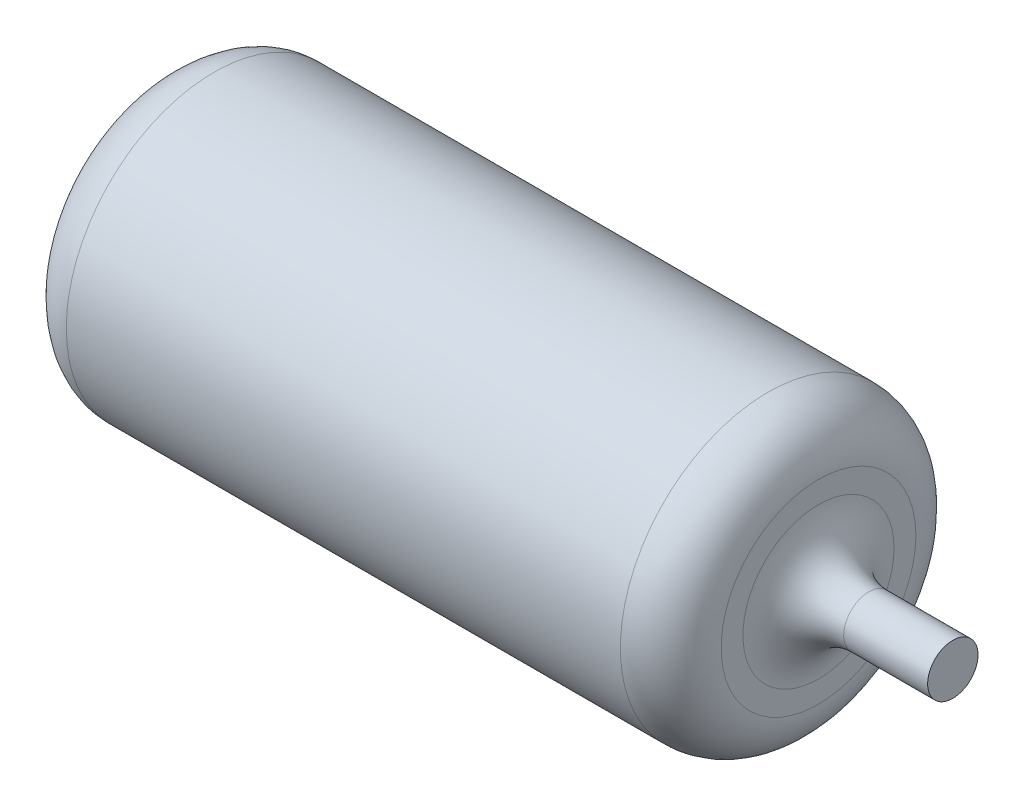
ISO-10303-21;
HEADER;
FILE_DESCRIPTION(('STEP AP214'),'2;1');
FILE_NAME('part.step','',(''),(''),'','','');
FILE_SCHEMA(('AUTOMOTIVE_DESIGN { 1 0 10303 214 1 1 1 1 }'));
ENDSEC;
DATA;
#1=APPLICATION_CONTEXT('core data for automotive mechanical design processes');
#2=APPLICATION_PROTOCOL_DEFINITION('international standard','automotive_design',2000,#1);
#3=PRODUCT_CONTEXT('',#1,'mechanical');
#4=PRODUCT('Part','Part','',(#3));
#5=PRODUCT_RELATED_PRODUCT_CATEGORY('part','',(#4));
#6=PRODUCT_DEFINITION_FORMATION('','',#4);
#7=PRODUCT_DEFINITION_CONTEXT('part definition',#1,'design');
#8=PRODUCT_DEFINITION('design','',#6,#7);
#9=PRODUCT_DEFINITION_SHAPE('','',#8);
#10=(LENGTH_UNIT() NAMED_UNIT(*) SI_UNIT(.MILLI.,.METRE.));
#11=(NAMED_UNIT(*) PLANE_ANGLE_UNIT() SI_UNIT($,.RADIAN.));
#12=(NAMED_UNIT(*) SI_UNIT($,.STERADIAN.) SOLID_ANGLE_UNIT());
#13=UNCERTAINTY_MEASURE_WITH_UNIT(LENGTH_MEASURE(1.E-05),#10,'distance_accuracy_value','');
#14=(GEOMETRIC_REPRESENTATION_CONTEXT(3) GLOBAL_UNCERTAINTY_ASSIGNED_CONTEXT((#13)) GLOBAL_UNIT_ASSIGNED_CONTEXT((#10,
#11,#12)) REPRESENTATION_CONTEXT('',''));
#15=CARTESIAN_POINT('',(0.,0.,0.));
#16=DIRECTION('',(0.,0.,1.));
#17=DIRECTION('',(1.,0.,0.));
#18=AXIS2_PLACEMENT_3D('',#15,#16,#17);
#19=CARTESIAN_POINT('',(0.,0.,0.));
#20=DIRECTION('',(-1.,0.,0.));
#21=DIRECTION('',(0.,0.,1.));
#22=AXIS2_PLACEMENT_3D('',#19,#20,#21);
#23=PLANE('',#22);
#24=CARTESIAN_POINT('',(0.,0.,-17.78));
#25=CARTESIAN_POINT('',(0.,2.32739655630741,-17.78));
#26=CARTESIAN_POINT('',(0.,4.65387738504043,-17.317234190695));
#27=CARTESIAN_POINT('',(0.,8.95434546986221,-15.5359219854064));
#28=CARTESIAN_POINT('',(0.,10.9266406820217,-14.21807645697));
#29=CARTESIAN_POINT('',(0.,14.2180764569719,-10.9266406820237));
#30=CARTESIAN_POINT('',(0.,15.5359219854104,-8.95434546986018));
#31=CARTESIAN_POINT('',(0.,17.3172341906909,-4.65387738504243));
#32=CARTESIAN_POINT('',(0.,17.78,-2.32739655630741));
#33=CARTESIAN_POINT('',(0.,17.78,2.32739655630741));
#34=CARTESIAN_POINT('',(0.,17.317234190695,4.65387738504242));
#35=CARTESIAN_POINT('',(0.,15.5359219854064,8.95434546986016));
#36=CARTESIAN_POINT('',(0.,14.2180764569707,10.9266406820209));
#37=CARTESIAN_POINT('',(0.,10.9266406820229,14.2180764569727));
#38=CARTESIAN_POINT('',(0.,8.95434546986097,15.5359219854081));
#39=CARTESIAN_POINT('',(0.,4.65387738504162,17.3172341906932));
#40=CARTESIAN_POINT('',(0.,2.32739655631956,17.78));
#41=CARTESIAN_POINT('',(0.,-2.32739655631956,17.78));
#42=CARTESIAN_POINT('',(0.,-4.65387738504465,17.3172341906932));
#43=CARTESIAN_POINT('',(0.,-8.95434546985794,15.5359219854082));
#44=CARTESIAN_POINT('',(0.,-10.9266406820269,14.2180764569687));
#45=CARTESIAN_POINT('',(0.,-14.2180764569667,10.9266406820249));
#46=CARTESIAN_POINT('',(0.,-15.5359219854024,8.95434546987834));
#47=CARTESIAN_POINT('',(0.,-17.317234190699,4.65387738502426));
#48=CARTESIAN_POINT('',(0.,-17.78,2.32739655630742));
#49=CARTESIAN_POINT('',(0.,-17.78,-2.3273965563074));
#50=CARTESIAN_POINT('',(0.,-17.317234190695,-4.65387738504144));
#51=CARTESIAN_POINT('',(0.,-15.5359219854064,-8.9543454698612));
#52=CARTESIAN_POINT('',(0.,-14.218076456972,-10.9266406820217));
#53=CARTESIAN_POINT('',(0.,-10.9266406820217,-14.2180764569719));
#54=CARTESIAN_POINT('',(0.,-8.95434546986115,-15.5359219854064));
#55=CARTESIAN_POINT('',(0.,-4.65387738504139,-17.317234190695));
#56=CARTESIAN_POINT('',(0.,-2.32739655630741,-17.78));
#57=CARTESIAN_POINT('',(0.,0.,-17.78));
#58=(BOUNDED_CURVE() B_SPLINE_CURVE(3,(#24,#25,#26,#27,#28,#29,#30,#31,#32,#33,#34,#35,#36,#37,
#38,#39,#40,#41,#42,#43,#44,#45,#46,#47,#48,#49,#50,#51,#52,#53,#54,#55,#56,#57),.UNSPECIFIED.,
.T.,.F.) B_SPLINE_CURVE_WITH_KNOTS((4,2,2,2,2,2,2,2,2,2,2,2,2,2,2,2,4),(-3.14159265358979,
-2.74889357189107,-2.35619449019234,-1.96349540849362,-1.5707963267949,-1.17809724509617,
-0.785398163397448,-0.392699081698724,0.,0.392699081698724,0.785398163397448,1.17809724509617,
1.5707963267949,1.96349540849362,2.35619449019234,2.74889357189107,3.14159265358979),
.UNSPECIFIED.) CURVE() GEOMETRIC_REPRESENTATION_ITEM() RATIONAL_B_SPLINE_CURVE((1.,1.,1.,1.,1.,
1.,1.,1.,1.,1.,1.,1.,1.,1.,1.,1.,1.,1.,1.,1.,1.,1.,1.,1.,1.,1.,1.,1.,1.,1.,1.,1.,1.,1.)) REPRESENTATION_ITEM(''));
#59=CARTESIAN_POINT('',(0.,0.,-17.78));
#60=VERTEX_POINT('',#59);
#61=EDGE_CURVE('E62',#60,#60,#58,.F.);
#62=ORIENTED_EDGE('',*,*,#61,.T.);
#63=EDGE_LOOP('',(#62));
#64=FACE_BOUND('',#63,.T.);
#65=ADVANCED_FACE('F42',(#64),#23,.T.);
#66=CARTESIAN_POINT('',(0.,0.,0.));
#67=DIRECTION('',(1.,0.,0.));
#68=DIRECTION('',(0.,0.,-1.));
#69=AXIS2_PLACEMENT_3D('',#66,#67,#68);
#70=CYLINDRICAL_SURFACE('',#69,55.88);
#71=CARTESIAN_POINT('',(234.95,0.,0.));
#72=DIRECTION('',(1.,0.,0.));
#73=DIRECTION('',(0.,0.,-1.));
#74=AXIS2_PLACEMENT_3D('',#71,#72,#73);
#75=CIRCLE('',#74,55.88);
#76=CARTESIAN_POINT('',(234.95,0.,-55.88));
#77=VERTEX_POINT('',#76);
#78=EDGE_CURVE('E49',#77,#77,#75,.F.);
#79=ORIENTED_EDGE('',*,*,#78,.T.);
#80=EDGE_LOOP('',(#79));
#81=FACE_BOUND('',#80,.T.);
#82=CARTESIAN_POINT('',(25.4,0.,-55.88));
#83=CARTESIAN_POINT('',(25.4,-7.31467489125185,-55.88));
#84=CARTESIAN_POINT('',(25.4,-14.6264717815592,-54.4255931707498));
#85=CARTESIAN_POINT('',(25.4,-28.1422286195631,-48.8271833827117));
#86=CARTESIAN_POINT('',(25.4,-34.3408707149236,-44.685383150485));
#87=CARTESIAN_POINT('',(25.4,-44.6853831504851,-34.3408707149235));
#88=CARTESIAN_POINT('',(25.4,-48.8271833827111,-28.1422286195644));
#89=CARTESIAN_POINT('',(25.4,-54.4255931707502,-14.6264717815582));
#90=CARTESIAN_POINT('',(25.4,-55.88,-7.31467489125181));
#91=CARTESIAN_POINT('',(25.4,-55.88,7.31467489125189));
#92=CARTESIAN_POINT('',(25.4,-54.4255931707735,14.6264717815019));
#93=CARTESIAN_POINT('',(25.4,-48.8271833826879,28.1422286196206));
#94=CARTESIAN_POINT('',(25.4,-44.6853831504667,34.3408707149419));
#95=CARTESIAN_POINT('',(25.4,-34.3408707149418,44.6853831504668));
#96=CARTESIAN_POINT('',(25.4,-28.1422286195538,48.8271833827155));
#97=CARTESIAN_POINT('',(25.4,-14.6264717815686,54.4255931707459));
#98=CARTESIAN_POINT('',(25.4,-7.31467489129005,55.88));
#99=CARTESIAN_POINT('',(25.4,7.31467489129005,55.88));
#100=CARTESIAN_POINT('',(25.4,14.6264717815583,54.4255931707502));
#101=CARTESIAN_POINT('',(25.4,28.1422286195642,48.8271833827112));
#102=CARTESIAN_POINT('',(25.4,34.3408707149257,44.6853831504829));
#103=CARTESIAN_POINT('',(25.4,44.6853831504829,34.3408707149257));
#104=CARTESIAN_POINT('',(25.4,48.8271833827129,28.1422286195603));
#105=CARTESIAN_POINT('',(25.4,54.4255931707486,14.6264717815621));
#106=CARTESIAN_POINT('',(25.4,55.88,7.31467489125186));
#107=CARTESIAN_POINT('',(25.4,55.88,-7.31467489125185));
#108=CARTESIAN_POINT('',(25.4,54.4255931707488,-14.6264717815616));
#109=CARTESIAN_POINT('',(25.4,48.8271833827126,-28.1422286195609));
#110=CARTESIAN_POINT('',(25.4,44.685383150481,-34.3408707149276));
#111=CARTESIAN_POINT('',(25.4,34.3408707149275,-44.685383150481));
#112=CARTESIAN_POINT('',(25.4,28.1422286195672,-48.8271833827099));
#113=CARTESIAN_POINT('',(25.4,14.6264717815553,-54.4255931707514));
#114=CARTESIAN_POINT('',(25.4,7.31467489125186,-55.88));
#115=CARTESIAN_POINT('',(25.4,0.,-55.88));
#116=(BOUNDED_CURVE() B_SPLINE_CURVE(3,(#82,#83,#84,#85,#86,#87,#88,#89,#90,#91,#92,#93,#94,#95,
#96,#97,#98,#99,#100,#101,#102,#103,#104,#105,#106,#107,#108,#109,#110,#111,#112,#113,#114,
#115),.UNSPECIFIED.,.T.,.F.) B_SPLINE_CURVE_WITH_KNOTS((4,2,2,2,2,2,2,2,2,2,2,2,2,2,2,2,4),
(-3.14159265358979,-2.74889357189107,-2.35619449019234,-1.96349540849362,-1.5707963267949,
-1.17809724509617,-0.785398163397448,-0.392699081698724,0.,0.392699081698724,0.785398163397448,
1.17809724509617,1.5707963267949,1.96349540849362,2.35619449019234,2.74889357189107,
3.14159265358979),
.UNSPECIFIED.) CURVE() GEOMETRIC_REPRESENTATION_ITEM() RATIONAL_B_SPLINE_CURVE((1.,1.,1.,1.,1.,
1.,1.,1.,1.,1.,1.,1.,1.,1.,1.,1.,1.,1.,1.,1.,1.,1.,1.,1.,1.,1.,1.,1.,1.,1.,1.,1.,1.,1.)) REPRESENTATION_ITEM(''));
#117=CARTESIAN_POINT('',(25.4,0.,-55.88));
#118=VERTEX_POINT('',#117);
#119=EDGE_CURVE('E121',#118,#118,#116,.F.);
#120=ORIENTED_EDGE('',*,*,#119,.T.);
#121=EDGE_LOOP('',(#120));
#122=FACE_BOUND('',#121,.T.);
#123=ADVANCED_FACE('F137',(#81,#122),#70,.T.);
#124=CARTESIAN_POINT('',(254.,55.88,0.));
#125=DIRECTION('',(1.,0.,0.));
#126=DIRECTION('',(0.,0.,-1.));
#127=AXIS2_PLACEMENT_3D('',#124,#125,#126);
#128=PLANE('',#127);
#129=CARTESIAN_POINT('',(254.,0.,0.));
#130=DIRECTION('',(1.,0.,0.));
#131=DIRECTION('',(0.,0.,-1.));
#132=AXIS2_PLACEMENT_3D('',#129,#130,#131);
#133=CIRCLE('',#132,36.83);
#134=CARTESIAN_POINT('',(254.,0.,-36.83));
#135=VERTEX_POINT('',#134);
#136=EDGE_CURVE('E53',#135,#135,#133,.T.);
#137=ORIENTED_EDGE('',*,*,#136,.T.);
#138=EDGE_LOOP('',(#137));
#139=FACE_BOUND('',#138,.T.);
#140=CARTESIAN_POINT('',(254.,0.,0.));
#141=DIRECTION('',(1.,0.,0.));
#142=DIRECTION('',(0.,0.,-1.));
#143=AXIS2_PLACEMENT_3D('',#140,#141,#142);
#144=CIRCLE('',#143,28.575);
#145=CARTESIAN_POINT('',(254.,0.,-28.575));
#146=VERTEX_POINT('',#145);
#147=EDGE_CURVE('E57',#146,#146,#144,.F.);
#148=ORIENTED_EDGE('',*,*,#147,.T.);
#149=EDGE_LOOP('',(#148));
#150=FACE_BOUND('',#149,.T.);
#151=ADVANCED_FACE('F146',(#139,#150),#128,.T.);
#152=CARTESIAN_POINT('',(0.,0.,0.));
#153=DIRECTION('',(1.,0.,0.));
#154=DIRECTION('',(0.,0.,-1.));
#155=AXIS2_PLACEMENT_3D('',#152,#153,#154);
#156=CYLINDRICAL_SURFACE('',#155,9.52500000000003);
#157=CARTESIAN_POINT('',(273.05,0.,0.));
#158=DIRECTION('',(1.,0.,0.));
#159=DIRECTION('',(0.,0.,-1.));
#160=AXIS2_PLACEMENT_3D('',#157,#158,#159);
#161=CIRCLE('',#160,9.52500000000003);
#162=CARTESIAN_POINT('',(273.05,0.,-9.52500000000003));
#163=VERTEX_POINT('',#162);
#164=EDGE_CURVE('E11',#163,#163,#161,.T.);
#165=ORIENTED_EDGE('',*,*,#164,.T.);
#166=EDGE_LOOP('',(#165));
#167=FACE_BOUND('',#166,.T.);
#168=CARTESIAN_POINT('',(304.8,0.,0.));
#169=DIRECTION('',(1.,0.,0.));
#170=DIRECTION('',(0.,0.,-1.));
#171=AXIS2_PLACEMENT_3D('',#168,#169,#170);
#172=CIRCLE('',#171,9.52500000000003);
#173=CARTESIAN_POINT('',(304.8,0.,-9.52500000000003));
#174=VERTEX_POINT('',#173);
#175=EDGE_CURVE('E215',#174,#174,#172,.T.);
#176=ORIENTED_EDGE('',*,*,#175,.F.);
#177=EDGE_LOOP('',(#176));
#178=FACE_BOUND('',#177,.T.);
#179=ADVANCED_FACE('F149',(#167,#178),#156,.T.);
#180=CARTESIAN_POINT('',(304.8,9.52500000000003,0.));
#181=DIRECTION('',(1.,0.,0.));
#182=DIRECTION('',(0.,0.,-1.));
#183=AXIS2_PLACEMENT_3D('',#180,#181,#182);
#184=PLANE('',#183);
#185=ORIENTED_EDGE('',*,*,#175,.T.);
#186=EDGE_LOOP('',(#185));
#187=FACE_BOUND('',#186,.T.);
#188=ADVANCED_FACE('F83',(#187),#184,.T.);
#189=CARTESIAN_POINT('',(0.,0.,-17.78));
#190=CARTESIAN_POINT('',(0.,-2.32739655630741,-17.78));
#191=CARTESIAN_POINT('',(0.,-4.65387738504139,-17.317234190695));
#192=CARTESIAN_POINT('',(0.,-8.95434546986115,-15.5359219854064));
#193=CARTESIAN_POINT('',(0.,-10.9266406820217,-14.2180764569719));
#194=CARTESIAN_POINT('',(0.,-14.218076456972,-10.9266406820217));
#195=CARTESIAN_POINT('',(0.,-15.5359219854064,-8.9543454698612));
#196=CARTESIAN_POINT('',(0.,-17.317234190695,-4.65387738504144));
#197=CARTESIAN_POINT('',(0.,-17.78,-2.3273965563074));
#198=CARTESIAN_POINT('',(0.,-17.78,2.32739655630742));
#199=CARTESIAN_POINT('',(0.,-17.317234190699,4.65387738502426));
#200=CARTESIAN_POINT('',(0.,-15.5359219854024,8.95434546987834));
#201=CARTESIAN_POINT('',(0.,-14.2180764569667,10.9266406820249));
#202=CARTESIAN_POINT('',(0.,-10.9266406820269,14.2180764569687));
#203=CARTESIAN_POINT('',(0.,-8.95434546985794,15.5359219854082));
#204=CARTESIAN_POINT('',(0.,-4.65387738504465,17.3172341906932));
#205=CARTESIAN_POINT('',(0.,-2.32739655631956,17.78));
#206=CARTESIAN_POINT('',(0.,2.32739655631956,17.78));
#207=CARTESIAN_POINT('',(0.,4.65387738504162,17.3172341906932));
#208=CARTESIAN_POINT('',(0.,8.95434546986097,15.5359219854081));
#209=CARTESIAN_POINT('',(0.,10.9266406820229,14.2180764569727));
#210=CARTESIAN_POINT('',(0.,14.2180764569707,10.9266406820209));
#211=CARTESIAN_POINT('',(0.,15.5359219854064,8.95434546986016));
#212=CARTESIAN_POINT('',(0.,17.317234190695,4.65387738504242));
#213=CARTESIAN_POINT('',(0.,17.78,2.32739655630741));
#214=CARTESIAN_POINT('',(0.,17.78,-2.32739655630741));
#215=CARTESIAN_POINT('',(0.,17.3172341906909,-4.65387738504243));
#216=CARTESIAN_POINT('',(0.,15.5359219854104,-8.95434546986018));
#217=CARTESIAN_POINT('',(0.,14.2180764569719,-10.9266406820237));
#218=CARTESIAN_POINT('',(0.,10.9266406820217,-14.21807645697));
#219=CARTESIAN_POINT('',(0.,8.95434546986221,-15.5359219854064));
#220=CARTESIAN_POINT('',(0.,4.65387738504043,-17.317234190695));
#221=CARTESIAN_POINT('',(0.,2.32739655630741,-17.78));
#222=CARTESIAN_POINT('',(0.,0.,-17.78));
#223=CARTESIAN_POINT('',(0.,0.,-55.88));
#224=CARTESIAN_POINT('',(0.,-7.31467489125185,-55.88));
#225=CARTESIAN_POINT('',(-8.07824833949173E-12,-14.626471781565,-54.4255931707637));
#226=CARTESIAN_POINT('',(8.07130944558783E-12,-28.1422286195573,-48.8271833826978));
#227=CARTESIAN_POINT('',(0.,-34.3408707149195,-44.6853831504729));
#228=CARTESIAN_POINT('',(0.,-44.6853831504891,-34.3408707149356));
#229=CARTESIAN_POINT('',(0.,-48.8271833827138,-28.1422286195655));
#230=CARTESIAN_POINT('',(0.,-54.4255931707475,-14.6264717815571));
#231=CARTESIAN_POINT('',(4.03738944626989E-12,-55.88,-7.31467489125181));
#232=CARTESIAN_POINT('',(-4.03738944626989E-12,-55.88,7.31467489125189));
#233=CARTESIAN_POINT('',(0.,-54.4255931707799,14.6264717815045));
#234=CARTESIAN_POINT('',(0.,-48.8271833826816,28.1422286196179));
#235=CARTESIAN_POINT('',(0.,-44.6853831504627,34.3408707149378));
#236=CARTESIAN_POINT('',(0.,-34.3408707149458,44.6853831504708));
#237=CARTESIAN_POINT('',(0.,-28.142228619548,48.8271833827113));
#238=CARTESIAN_POINT('',(0.,-14.6264717815744,54.4255931707501));
#239=CARTESIAN_POINT('',(0.,-7.31467489129005,55.88));
#240=CARTESIAN_POINT('',(0.,7.31467489129005,55.88));
#241=CARTESIAN_POINT('',(0.,14.6264717815542,54.4255931707339));
#242=CARTESIAN_POINT('',(0.,28.1422286195682,48.8271833827275));
#243=CARTESIAN_POINT('',(0.,34.3408707149297,44.6853831504869));
#244=CARTESIAN_POINT('',(0.,44.6853831504789,34.3408707149216));
#245=CARTESIAN_POINT('',(0.,48.8271833827058,28.1422286195573));
#246=CARTESIAN_POINT('',(0.,54.4255931707556,14.6264717815651));
#247=CARTESIAN_POINT('',(0.,55.88,7.31467489125186));
#248=CARTESIAN_POINT('',(0.,55.88,-7.31467489125185));
#249=CARTESIAN_POINT('',(0.,54.4255931707556,-14.6264717815651));
#250=CARTESIAN_POINT('',(0.,48.8271833827058,-28.1422286195574));
#251=CARTESIAN_POINT('',(0.,44.6853831504729,-34.3408707149357));
#252=CARTESIAN_POINT('',(0.,34.3408707149356,-44.6853831504729));
#253=CARTESIAN_POINT('',(0.,28.1422286195655,-48.8271833827138));
#254=CARTESIAN_POINT('',(0.,14.6264717815571,-54.4255931707475));
#255=CARTESIAN_POINT('',(0.,7.31467489125186,-55.88));
#256=CARTESIAN_POINT('',(0.,0.,-55.88));
#257=CARTESIAN_POINT('',(25.4,0.,-55.88));
#258=CARTESIAN_POINT('',(25.4,-7.31467489125185,-55.88));
#259=CARTESIAN_POINT('',(25.4,-14.6264717815592,-54.4255931707498));
#260=CARTESIAN_POINT('',(25.4,-28.1422286195631,-48.8271833827117));
#261=CARTESIAN_POINT('',(25.4,-34.3408707149236,-44.685383150485));
#262=CARTESIAN_POINT('',(25.4,-44.6853831504851,-34.3408707149235));
#263=CARTESIAN_POINT('',(25.4,-48.8271833827111,-28.1422286195644));
#264=CARTESIAN_POINT('',(25.4,-54.4255931707502,-14.6264717815582));
#265=CARTESIAN_POINT('',(25.4,-55.88,-7.31467489125181));
#266=CARTESIAN_POINT('',(25.4,-55.88,7.31467489125189));
#267=CARTESIAN_POINT('',(25.4,-54.4255931707735,14.6264717815019));
#268=CARTESIAN_POINT('',(25.4,-48.8271833826879,28.1422286196206));
#269=CARTESIAN_POINT('',(25.4,-44.6853831504667,34.3408707149419));
#270=CARTESIAN_POINT('',(25.4,-34.3408707149418,44.6853831504668));
#271=CARTESIAN_POINT('',(25.4,-28.1422286195538,48.8271833827155));
#272=CARTESIAN_POINT('',(25.4,-14.6264717815686,54.4255931707459));
#273=CARTESIAN_POINT('',(25.4,-7.31467489129005,55.88));
#274=CARTESIAN_POINT('',(25.4,7.31467489129005,55.88));
#275=CARTESIAN_POINT('',(25.4,14.6264717815583,54.4255931707502));
#276=CARTESIAN_POINT('',(25.4,28.1422286195642,48.8271833827112));
#277=CARTESIAN_POINT('',(25.4,34.3408707149257,44.6853831504829));
#278=CARTESIAN_POINT('',(25.4,44.6853831504829,34.3408707149257));
#279=CARTESIAN_POINT('',(25.4,48.8271833827129,28.1422286195603));
#280=CARTESIAN_POINT('',(25.4,54.4255931707486,14.6264717815621));
#281=CARTESIAN_POINT('',(25.4,55.88,7.31467489125186));
#282=CARTESIAN_POINT('',(25.4,55.88,-7.31467489125185));
#283=CARTESIAN_POINT('',(25.4,54.4255931707488,-14.6264717815616));
#284=CARTESIAN_POINT('',(25.4,48.8271833827126,-28.1422286195609));
#285=CARTESIAN_POINT('',(25.4,44.685383150481,-34.3408707149276));
#286=CARTESIAN_POINT('',(25.4,34.3408707149275,-44.685383150481));
#287=CARTESIAN_POINT('',(25.4,28.1422286195672,-48.8271833827099));
#288=CARTESIAN_POINT('',(25.4,14.6264717815553,-54.4255931707514));
#289=CARTESIAN_POINT('',(25.4,7.31467489125186,-55.88));
#290=CARTESIAN_POINT('',(25.4,0.,-55.88));
#291=(BOUNDED_SURFACE() B_SPLINE_SURFACE(2,3,((#189,#190,#191,#192,#193,#194,#195,#196,#197,
#198,#199,#200,#201,#202,#203,#204,#205,#206,#207,#208,#209,#210,#211,#212,#213,#214,#215,#216,
#217,#218,#219,#220,#221,#222),(#223,#224,#225,#226,#227,#228,#229,#230,#231,#232,#233,#234,
#235,#236,#237,#238,#239,#240,#241,#242,#243,#244,#245,#246,#247,#248,#249,#250,#251,#252,#253,
#254,#255,#256),(#257,#258,#259,#260,#261,#262,#263,#264,#265,#266,#267,#268,#269,#270,#271,
#272,#273,#274,#275,#276,#277,#278,#279,#280,#281,#282,#283,#284,#285,#286,#287,#288,#289,
#290)),.UNSPECIFIED.,.F.,.T.,.F.) B_SPLINE_SURFACE_WITH_KNOTS((3,3),(4,2,2,2,2,2,2,2,2,2,2,2,2,
2,2,2,4),(0.,1.),(-3.14159265358979,-2.74889357189107,-2.35619449019234,-1.96349540849362,
-1.5707963267949,-1.17809724509617,-0.785398163397448,-0.392699081698724,0.,0.392699081698724,
0.785398163397448,1.17809724509617,1.5707963267949,1.96349540849362,2.35619449019234,
2.74889357189107,3.14159265358979),
.UNSPECIFIED.) GEOMETRIC_REPRESENTATION_ITEM() RATIONAL_B_SPLINE_SURFACE(((1.,1.,1.,1.,1.,1.,1.,
1.,1.,1.,1.,1.,1.,1.,1.,1.,1.,1.,1.,1.,1.,1.,1.,1.,1.,1.,1.,1.,1.,1.,1.,1.,1.,1.),
(0.707106781186547,0.707106781186547,0.707106781186547,0.707106781186547,0.707106781186548,
0.707106781186548,0.707106781186547,0.707106781186547,0.707106781186547,0.707106781186547,
0.707106781186547,0.707106781186547,0.707106781186548,0.707106781186548,0.707106781186547,
0.707106781186547,0.707106781186547,0.707106781186547,0.707106781186547,0.707106781186547,
0.707106781186547,0.707106781186547,0.707106781186547,0.707106781186547,0.707106781186547,
0.707106781186547,0.707106781186547,0.707106781186547,0.707106781186547,0.707106781186547,
0.707106781186547,0.707106781186547,0.707106781186547,0.707106781186547),(1.,1.,1.,1.,1.,1.,1.,
1.,1.,1.,1.,1.,1.,1.,1.,1.,1.,1.,1.,1.,1.,1.,1.,1.,1.,1.,1.,1.,1.,1.,1.,1.,1.,1.))) REPRESENTATION_ITEM('') SURFACE());
#292=ORIENTED_EDGE('',*,*,#61,.F.);
#293=EDGE_LOOP('',(#292));
#294=FACE_BOUND('',#293,.T.);
#295=ORIENTED_EDGE('',*,*,#119,.F.);
#296=EDGE_LOOP('',(#295));
#297=FACE_BOUND('',#296,.T.);
#298=ADVANCED_FACE('F69',(#294,#297),#291,.T.);
#299=CARTESIAN_POINT('',(234.95,0.,0.));
#300=DIRECTION('',(1.,0.,0.));
#301=DIRECTION('',(0.,0.,-1.));
#302=AXIS2_PLACEMENT_3D('',#299,#300,#301);
#303=TOROIDAL_SURFACE('',#302,36.83,19.05);
#304=ORIENTED_EDGE('',*,*,#78,.F.);
#305=EDGE_LOOP('',(#304));
#306=FACE_BOUND('',#305,.T.);
#307=ORIENTED_EDGE('',*,*,#136,.F.);
#308=EDGE_LOOP('',(#307));
#309=FACE_BOUND('',#308,.T.);
#310=ADVANCED_FACE('F82',(#306,#309),#303,.T.);
#311=CARTESIAN_POINT('',(273.05,0.,0.));
#312=DIRECTION('',(1.,0.,0.));
#313=DIRECTION('',(0.,0.,-1.));
#314=AXIS2_PLACEMENT_3D('',#311,#312,#313);
#315=TOROIDAL_SURFACE('',#314,28.575,19.05);
#316=ORIENTED_EDGE('',*,*,#147,.F.);
#317=EDGE_LOOP('',(#316));
#318=FACE_BOUND('',#317,.T.);
#319=ORIENTED_EDGE('',*,*,#164,.F.);
#320=EDGE_LOOP('',(#319));
#321=FACE_BOUND('',#320,.T.);
#322=ADVANCED_FACE('F44',(#318,#321),#315,.F.);
#323=CLOSED_SHELL('',(#65,#123,#151,#179,#188,#298,#310,#322));
#324=MANIFOLD_SOLID_BREP('B2',#323);
#325=ADVANCED_BREP_SHAPE_REPRESENTATION('',(#18,#324),#14);
#326=SHAPE_DEFINITION_REPRESENTATION(#9,#325);
ENDSEC;
END-ISO-10303-21;
